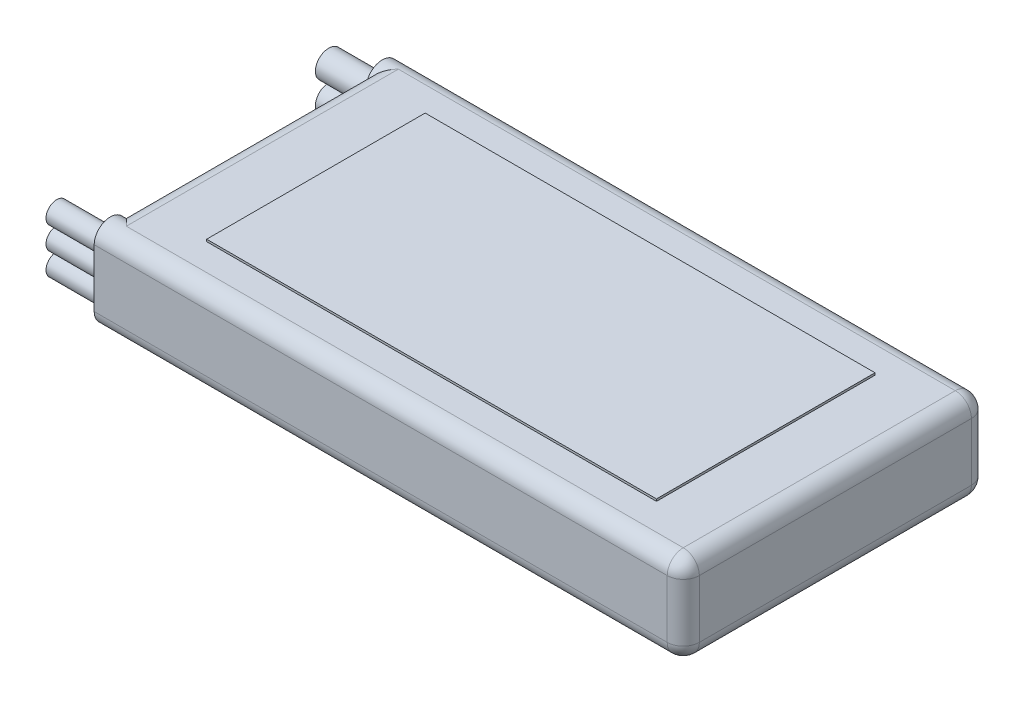
ISO-10303-21;
HEADER;
FILE_DESCRIPTION(('STEP AP214'),'2;1');
FILE_NAME('part.step','',(''),(''),'','','');
FILE_SCHEMA(('AUTOMOTIVE_DESIGN { 1 0 10303 214 1 1 1 1 }'));
ENDSEC;
DATA;
#1=APPLICATION_CONTEXT('core data for automotive mechanical design processes');
#2=APPLICATION_PROTOCOL_DEFINITION('international standard','automotive_design',2000,#1);
#3=PRODUCT_CONTEXT('',#1,'mechanical');
#4=PRODUCT('Part','Part','',(#3));
#5=PRODUCT_RELATED_PRODUCT_CATEGORY('part','',(#4));
#6=PRODUCT_DEFINITION_FORMATION('','',#4);
#7=PRODUCT_DEFINITION_CONTEXT('part definition',#1,'design');
#8=PRODUCT_DEFINITION('design','',#6,#7);
#9=PRODUCT_DEFINITION_SHAPE('','',#8);
#10=(LENGTH_UNIT() NAMED_UNIT(*) SI_UNIT(.MILLI.,.METRE.));
#11=(NAMED_UNIT(*) PLANE_ANGLE_UNIT() SI_UNIT($,.RADIAN.));
#12=(NAMED_UNIT(*) SI_UNIT($,.STERADIAN.) SOLID_ANGLE_UNIT());
#13=UNCERTAINTY_MEASURE_WITH_UNIT(LENGTH_MEASURE(1.E-05),#10,'distance_accuracy_value','');
#14=(GEOMETRIC_REPRESENTATION_CONTEXT(3) GLOBAL_UNCERTAINTY_ASSIGNED_CONTEXT((#13)) GLOBAL_UNIT_ASSIGNED_CONTEXT((#10,
#11,#12)) REPRESENTATION_CONTEXT('',''));
#15=CARTESIAN_POINT('',(0.,0.,0.));
#16=DIRECTION('',(0.,0.,1.));
#17=DIRECTION('',(1.,0.,0.));
#18=AXIS2_PLACEMENT_3D('',#15,#16,#17);
#19=CARTESIAN_POINT('',(0.,10.668,0.));
#20=DIRECTION('',(0.,1.,0.));
#21=DIRECTION('',(0.,0.,1.));
#22=AXIS2_PLACEMENT_3D('',#19,#20,#21);
#23=PLANE('',#22);
#24=DIRECTION('',(0.,0.,-1.));
#25=VECTOR('',#24,1.);
#26=CARTESIAN_POINT('',(41.4199177552008,10.668,-23.1597613288179));
#27=LINE('',#26,#25);
#28=CARTESIAN_POINT('',(41.4199177552008,10.668,11.0032386711821));
#29=VERTEX_POINT('',#28);
#30=CARTESIAN_POINT('',(41.4199177552008,10.668,-21.2547613288179));
#31=VERTEX_POINT('',#30);
#32=EDGE_CURVE('E257',#29,#31,#27,.T.);
#33=ORIENTED_EDGE('',*,*,#32,.T.);
#34=DIRECTION('',(-1.,0.,0.));
#35=VECTOR('',#34,1.);
#36=CARTESIAN_POINT('',(-26.5250822447992,10.668,-21.2547613288179));
#37=LINE('',#36,#35);
#38=CARTESIAN_POINT('',(-24.6200822447992,10.668,-21.2547613288179));
#39=VERTEX_POINT('',#38);
#40=EDGE_CURVE('E259',#31,#39,#37,.T.);
#41=ORIENTED_EDGE('',*,*,#40,.T.);
#42=DIRECTION('',(0.,0.,1.));
#43=VECTOR('',#42,1.);
#44=CARTESIAN_POINT('',(-24.6200822447992,10.668,12.9082386711821));
#45=LINE('',#44,#43);
#46=CARTESIAN_POINT('',(-24.6200822447992,10.668,11.0032386711821));
#47=VERTEX_POINT('',#46);
#48=EDGE_CURVE('E252',#39,#47,#45,.T.);
#49=ORIENTED_EDGE('',*,*,#48,.T.);
#50=DIRECTION('',(1.,0.,0.));
#51=VECTOR('',#50,1.);
#52=CARTESIAN_POINT('',(43.3249177552008,10.668,11.0032386711821));
#53=LINE('',#52,#51);
#54=EDGE_CURVE('E255',#47,#29,#53,.T.);
#55=ORIENTED_EDGE('',*,*,#54,.T.);
#56=EDGE_LOOP('',(#33,#41,#49,#55));
#57=FACE_BOUND('',#56,.T.);
#58=DIRECTION('',(-1.,0.,0.));
#59=VECTOR('',#58,1.);
#60=CARTESIAN_POINT('',(35.0699177552008,10.668,-18.0797613288179));
#61=LINE('',#60,#59);
#62=CARTESIAN_POINT('',(35.0699177552008,10.668,-18.0797613288179));
#63=VERTEX_POINT('',#62);
#64=CARTESIAN_POINT('',(-18.2700822447992,10.668,-18.0797613288179));
#65=VERTEX_POINT('',#64);
#66=EDGE_CURVE('E632',#63,#65,#61,.T.);
#67=ORIENTED_EDGE('',*,*,#66,.F.);
#68=DIRECTION('',(0.,0.,-1.));
#69=VECTOR('',#68,1.);
#70=CARTESIAN_POINT('',(35.0699177552008,10.668,7.82823867118206));
#71=LINE('',#70,#69);
#72=CARTESIAN_POINT('',(35.0699177552008,10.668,7.82823867118206));
#73=VERTEX_POINT('',#72);
#74=EDGE_CURVE('E172',#73,#63,#71,.T.);
#75=ORIENTED_EDGE('',*,*,#74,.F.);
#76=DIRECTION('',(1.,0.,0.));
#77=VECTOR('',#76,1.);
#78=CARTESIAN_POINT('',(35.0699177552008,10.668,7.82823867118206));
#79=LINE('',#78,#77);
#80=CARTESIAN_POINT('',(-18.2700822447992,10.668,7.82823867118207));
#81=VERTEX_POINT('',#80);
#82=EDGE_CURVE('E168',#81,#73,#79,.T.);
#83=ORIENTED_EDGE('',*,*,#82,.F.);
#84=DIRECTION('',(0.,0.,1.));
#85=VECTOR('',#84,1.);
#86=CARTESIAN_POINT('',(-18.2700822447992,10.668,7.82823867118207));
#87=LINE('',#86,#85);
#88=EDGE_CURVE('E629',#65,#81,#87,.T.);
#89=ORIENTED_EDGE('',*,*,#88,.F.);
#90=EDGE_LOOP('',(#67,#75,#83,#89));
#91=FACE_BOUND('',#90,.T.);
#92=ADVANCED_FACE('F35',(#57,#91),#23,.T.);
#93=CARTESIAN_POINT('',(-26.5250822447992,10.668,-23.1597613288179));
#94=DIRECTION('',(1.,0.,0.));
#95=DIRECTION('',(0.,0.,-1.));
#96=AXIS2_PLACEMENT_3D('',#93,#94,#95);
#97=PLANE('',#96);
#98=CARTESIAN_POINT('',(-26.5250822447992,7.112,-21.2547613288179));
#99=DIRECTION('',(1.,0.,0.));
#100=DIRECTION('',(0.,0.,-1.));
#101=AXIS2_PLACEMENT_3D('',#98,#99,#100);
#102=CIRCLE('',#101,1.5875);
#103=CARTESIAN_POINT('',(-26.5250822447992,7.112,-22.8422613288179));
#104=VERTEX_POINT('',#103);
#105=EDGE_CURVE('E43',#104,#104,#102,.F.);
#106=ORIENTED_EDGE('',*,*,#105,.F.);
#107=EDGE_LOOP('',(#106));
#108=FACE_BOUND('',#107,.T.);
#109=CARTESIAN_POINT('',(-26.5250822447992,5.334,11.0032386711821));
#110=DIRECTION('',(1.,0.,0.));
#111=DIRECTION('',(0.,0.,-1.));
#112=AXIS2_PLACEMENT_3D('',#109,#110,#111);
#113=CIRCLE('',#112,1.27);
#114=CARTESIAN_POINT('',(-26.5250822447992,5.334,9.73323867118206));
#115=VERTEX_POINT('',#114);
#116=EDGE_CURVE('E300',#115,#115,#113,.F.);
#117=ORIENTED_EDGE('',*,*,#116,.F.);
#118=EDGE_LOOP('',(#117));
#119=FACE_BOUND('',#118,.T.);
#120=DIRECTION('',(0.,0.,1.));
#121=VECTOR('',#120,1.);
#122=CARTESIAN_POINT('',(-26.5250822447992,8.763,-23.1597613288179));
#123=LINE('',#122,#121);
#124=CARTESIAN_POINT('',(-26.5250822447992,8.763,9.09823867118206));
#125=VERTEX_POINT('',#124);
#126=CARTESIAN_POINT('',(-26.5250822447992,8.763,-19.3497613288179));
#127=VERTEX_POINT('',#126);
#128=EDGE_CURVE('E240',#125,#127,#123,.F.);
#129=ORIENTED_EDGE('',*,*,#128,.T.);
#130=CARTESIAN_POINT('',(-26.5250822447992,8.763,-21.2547613288179));
#131=DIRECTION('',(-1.,0.,0.));
#132=DIRECTION('',(0.,0.,1.));
#133=AXIS2_PLACEMENT_3D('',#130,#131,#132);
#134=CIRCLE('',#133,1.905);
#135=CARTESIAN_POINT('',(-26.5250822447992,8.763,-23.1597613288179));
#136=VERTEX_POINT('',#135);
#137=EDGE_CURVE('E193',#127,#136,#134,.T.);
#138=ORIENTED_EDGE('',*,*,#137,.T.);
#139=DIRECTION('',(0.,-1.,0.));
#140=VECTOR('',#139,1.);
#141=CARTESIAN_POINT('',(-26.5250822447992,8.763,-23.1597613288179));
#142=LINE('',#141,#140);
#143=CARTESIAN_POINT('',(-26.5250822447992,1.905,-23.1597613288179));
#144=VERTEX_POINT('',#143);
#145=EDGE_CURVE('E196',#136,#144,#142,.T.);
#146=ORIENTED_EDGE('',*,*,#145,.T.);
#147=CARTESIAN_POINT('',(-26.5250822447992,1.905,-21.2547613288179));
#148=DIRECTION('',(-1.,0.,0.));
#149=DIRECTION('',(0.,0.,1.));
#150=AXIS2_PLACEMENT_3D('',#147,#148,#149);
#151=CIRCLE('',#150,1.905);
#152=CARTESIAN_POINT('',(-26.5250822447992,1.905,-19.3497613288179));
#153=VERTEX_POINT('',#152);
#154=EDGE_CURVE('E58',#144,#153,#151,.T.);
#155=ORIENTED_EDGE('',*,*,#154,.T.);
#156=DIRECTION('',(0.,0.,1.));
#157=VECTOR('',#156,1.);
#158=CARTESIAN_POINT('',(-26.5250822447992,1.905,-23.1597613288179));
#159=LINE('',#158,#157);
#160=CARTESIAN_POINT('',(-26.5250822447992,1.905,9.09823867118206));
#161=VERTEX_POINT('',#160);
#162=EDGE_CURVE('E243',#153,#161,#159,.T.);
#163=ORIENTED_EDGE('',*,*,#162,.T.);
#164=CARTESIAN_POINT('',(-26.5250822447992,1.905,11.0032386711821));
#165=DIRECTION('',(-1.,0.,0.));
#166=DIRECTION('',(0.,0.,1.));
#167=AXIS2_PLACEMENT_3D('',#164,#165,#166);
#168=CIRCLE('',#167,1.905);
#169=CARTESIAN_POINT('',(-26.5250822447992,1.905,12.9082386711821));
#170=VERTEX_POINT('',#169);
#171=EDGE_CURVE('E202',#161,#170,#168,.T.);
#172=ORIENTED_EDGE('',*,*,#171,.T.);
#173=DIRECTION('',(0.,1.,0.));
#174=VECTOR('',#173,1.);
#175=CARTESIAN_POINT('',(-26.5250822447992,8.763,12.9082386711821));
#176=LINE('',#175,#174);
#177=CARTESIAN_POINT('',(-26.5250822447992,8.763,12.9082386711821));
#178=VERTEX_POINT('',#177);
#179=EDGE_CURVE('E205',#170,#178,#176,.T.);
#180=ORIENTED_EDGE('',*,*,#179,.T.);
#181=CARTESIAN_POINT('',(-26.5250822447992,8.763,11.0032386711821));
#182=DIRECTION('',(-1.,0.,0.));
#183=DIRECTION('',(0.,0.,1.));
#184=AXIS2_PLACEMENT_3D('',#181,#182,#183);
#185=CIRCLE('',#184,1.905);
#186=EDGE_CURVE('E199',#178,#125,#185,.T.);
#187=ORIENTED_EDGE('',*,*,#186,.T.);
#188=EDGE_LOOP('',(#129,#138,#146,#155,#163,#172,#180,#187));
#189=FACE_BOUND('',#188,.T.);
#190=CARTESIAN_POINT('',(-26.5250822447992,8.001,11.0032386711821));
#191=DIRECTION('',(1.,0.,0.));
#192=DIRECTION('',(0.,0.,-1.));
#193=AXIS2_PLACEMENT_3D('',#190,#191,#192);
#194=CIRCLE('',#193,1.27);
#195=CARTESIAN_POINT('',(-26.5250822447992,8.001,9.73323867118206));
#196=VERTEX_POINT('',#195);
#197=EDGE_CURVE('E297',#196,#196,#194,.F.);
#198=ORIENTED_EDGE('',*,*,#197,.F.);
#199=EDGE_LOOP('',(#198));
#200=FACE_BOUND('',#199,.T.);
#201=CARTESIAN_POINT('',(-26.5250822447992,2.667,11.0032386711821));
#202=DIRECTION('',(1.,0.,0.));
#203=DIRECTION('',(0.,0.,-1.));
#204=AXIS2_PLACEMENT_3D('',#201,#202,#203);
#205=CIRCLE('',#204,1.27);
#206=CARTESIAN_POINT('',(-26.5250822447992,2.667,9.73323867118206));
#207=VERTEX_POINT('',#206);
#208=EDGE_CURVE('E303',#207,#207,#205,.F.);
#209=ORIENTED_EDGE('',*,*,#208,.F.);
#210=EDGE_LOOP('',(#209));
#211=FACE_BOUND('',#210,.T.);
#212=CARTESIAN_POINT('',(-26.5250822447992,3.556,-21.2547613288179));
#213=DIRECTION('',(1.,0.,0.));
#214=DIRECTION('',(0.,0.,-1.));
#215=AXIS2_PLACEMENT_3D('',#212,#213,#214);
#216=CIRCLE('',#215,1.5875);
#217=CARTESIAN_POINT('',(-26.5250822447992,3.556,-22.8422613288179));
#218=VERTEX_POINT('',#217);
#219=EDGE_CURVE('E11',#218,#218,#216,.F.);
#220=ORIENTED_EDGE('',*,*,#219,.F.);
#221=EDGE_LOOP('',(#220));
#222=FACE_BOUND('',#221,.T.);
#223=ADVANCED_FACE('F310',(#108,#119,#189,#200,#211,#222),#97,.F.);
#224=CARTESIAN_POINT('',(-26.5250822447992,10.668,12.9082386711821));
#225=DIRECTION('',(0.,0.,-1.));
#226=DIRECTION('',(-1.,0.,0.));
#227=AXIS2_PLACEMENT_3D('',#224,#225,#226);
#228=PLANE('',#227);
#229=DIRECTION('',(1.,0.,0.));
#230=VECTOR('',#229,1.);
#231=CARTESIAN_POINT('',(-26.5250822447992,1.905,12.9082386711821));
#232=LINE('',#231,#230);
#233=CARTESIAN_POINT('',(41.4199177552008,1.905,12.9082386711821));
#234=VERTEX_POINT('',#233);
#235=EDGE_CURVE('E226',#170,#234,#232,.T.);
#236=ORIENTED_EDGE('',*,*,#235,.T.);
#237=DIRECTION('',(0.,-1.,0.));
#238=VECTOR('',#237,1.);
#239=CARTESIAN_POINT('',(41.4199177552008,10.668,12.9082386711821));
#240=LINE('',#239,#238);
#241=CARTESIAN_POINT('',(41.4199177552008,8.763,12.9082386711821));
#242=VERTEX_POINT('',#241);
#243=EDGE_CURVE('E228',#234,#242,#240,.F.);
#244=ORIENTED_EDGE('',*,*,#243,.T.);
#245=DIRECTION('',(1.,0.,0.));
#246=VECTOR('',#245,1.);
#247=CARTESIAN_POINT('',(-26.5250822447992,8.763,12.9082386711821));
#248=LINE('',#247,#246);
#249=EDGE_CURVE('E224',#242,#178,#248,.F.);
#250=ORIENTED_EDGE('',*,*,#249,.T.);
#251=ORIENTED_EDGE('',*,*,#179,.F.);
#252=EDGE_LOOP('',(#236,#244,#250,#251));
#253=FACE_BOUND('',#252,.T.);
#254=ADVANCED_FACE('F313',(#253),#228,.F.);
#255=CARTESIAN_POINT('',(43.3249177552008,10.668,-23.1597613288179));
#256=DIRECTION('',(-1.,0.,0.));
#257=DIRECTION('',(0.,0.,1.));
#258=AXIS2_PLACEMENT_3D('',#255,#256,#257);
#259=PLANE('',#258);
#260=DIRECTION('',(0.,0.,-1.));
#261=VECTOR('',#260,1.);
#262=CARTESIAN_POINT('',(43.3249177552008,8.763,12.9082386711821));
#263=LINE('',#262,#261);
#264=CARTESIAN_POINT('',(43.3249177552008,8.763,-21.2547613288179));
#265=VERTEX_POINT('',#264);
#266=CARTESIAN_POINT('',(43.3249177552008,8.763,11.0032386711821));
#267=VERTEX_POINT('',#266);
#268=EDGE_CURVE('E214',#265,#267,#263,.F.);
#269=ORIENTED_EDGE('',*,*,#268,.T.);
#270=DIRECTION('',(0.,-1.,0.));
#271=VECTOR('',#270,1.);
#272=CARTESIAN_POINT('',(43.3249177552008,10.668,11.0032386711821));
#273=LINE('',#272,#271);
#274=CARTESIAN_POINT('',(43.3249177552008,1.905,11.0032386711821));
#275=VERTEX_POINT('',#274);
#276=EDGE_CURVE('E221',#267,#275,#273,.T.);
#277=ORIENTED_EDGE('',*,*,#276,.T.);
#278=DIRECTION('',(0.,0.,-1.));
#279=VECTOR('',#278,1.);
#280=CARTESIAN_POINT('',(43.3249177552008,1.905,-23.1597613288179));
#281=LINE('',#280,#279);
#282=CARTESIAN_POINT('',(43.3249177552008,1.905,-21.2547613288179));
#283=VERTEX_POINT('',#282);
#284=EDGE_CURVE('E219',#275,#283,#281,.T.);
#285=ORIENTED_EDGE('',*,*,#284,.T.);
#286=DIRECTION('',(0.,-1.,0.));
#287=VECTOR('',#286,1.);
#288=CARTESIAN_POINT('',(43.3249177552008,10.668,-21.2547613288179));
#289=LINE('',#288,#287);
#290=EDGE_CURVE('E216',#283,#265,#289,.F.);
#291=ORIENTED_EDGE('',*,*,#290,.T.);
#292=EDGE_LOOP('',(#269,#277,#285,#291));
#293=FACE_BOUND('',#292,.T.);
#294=ADVANCED_FACE('F356',(#293),#259,.F.);
#295=CARTESIAN_POINT('',(-26.5250822447992,10.668,-23.1597613288179));
#296=DIRECTION('',(0.,0.,1.));
#297=DIRECTION('',(1.,0.,0.));
#298=AXIS2_PLACEMENT_3D('',#295,#296,#297);
#299=PLANE('',#298);
#300=DIRECTION('',(-1.,0.,0.));
#301=VECTOR('',#300,1.);
#302=CARTESIAN_POINT('',(43.3249177552008,8.763,-23.1597613288179));
#303=LINE('',#302,#301);
#304=CARTESIAN_POINT('',(41.4199177552008,8.763,-23.1597613288179));
#305=VERTEX_POINT('',#304);
#306=EDGE_CURVE('E245',#136,#305,#303,.F.);
#307=ORIENTED_EDGE('',*,*,#306,.T.);
#308=DIRECTION('',(0.,-1.,0.));
#309=VECTOR('',#308,1.);
#310=CARTESIAN_POINT('',(41.4199177552008,10.668,-23.1597613288179));
#311=LINE('',#310,#309);
#312=CARTESIAN_POINT('',(41.4199177552008,1.905,-23.1597613288179));
#313=VERTEX_POINT('',#312);
#314=EDGE_CURVE('E247',#305,#313,#311,.T.);
#315=ORIENTED_EDGE('',*,*,#314,.T.);
#316=DIRECTION('',(-1.,0.,0.));
#317=VECTOR('',#316,1.);
#318=CARTESIAN_POINT('',(-26.5250822447992,1.905,-23.1597613288179));
#319=LINE('',#318,#317);
#320=EDGE_CURVE('E250',#313,#144,#319,.T.);
#321=ORIENTED_EDGE('',*,*,#320,.T.);
#322=ORIENTED_EDGE('',*,*,#145,.F.);
#323=EDGE_LOOP('',(#307,#315,#321,#322));
#324=FACE_BOUND('',#323,.T.);
#325=ADVANCED_FACE('F352',(#324),#299,.F.);
#326=CARTESIAN_POINT('',(0.,0.,0.));
#327=DIRECTION('',(0.,1.,0.));
#328=DIRECTION('',(0.,0.,1.));
#329=AXIS2_PLACEMENT_3D('',#326,#327,#328);
#330=PLANE('',#329);
#331=DIRECTION('',(0.,0.,-1.));
#332=VECTOR('',#331,1.);
#333=CARTESIAN_POINT('',(41.4199177552008,0.,0.));
#334=LINE('',#333,#332);
#335=CARTESIAN_POINT('',(41.4199177552008,0.,-21.2547613288179));
#336=VERTEX_POINT('',#335);
#337=CARTESIAN_POINT('',(41.4199177552008,0.,11.0032386711821));
#338=VERTEX_POINT('',#337);
#339=EDGE_CURVE('E236',#336,#338,#334,.F.);
#340=ORIENTED_EDGE('',*,*,#339,.T.);
#341=DIRECTION('',(1.,0.,0.));
#342=VECTOR('',#341,1.);
#343=CARTESIAN_POINT('',(0.,0.,11.0032386711821));
#344=LINE('',#343,#342);
#345=CARTESIAN_POINT('',(-24.6200822447992,0.,11.0032386711821));
#346=VERTEX_POINT('',#345);
#347=EDGE_CURVE('E238',#338,#346,#344,.F.);
#348=ORIENTED_EDGE('',*,*,#347,.T.);
#349=DIRECTION('',(0.,0.,1.));
#350=VECTOR('',#349,1.);
#351=CARTESIAN_POINT('',(-24.6200822447992,0.,0.));
#352=LINE('',#351,#350);
#353=CARTESIAN_POINT('',(-24.6200822447992,0.,-21.2547613288179));
#354=VERTEX_POINT('',#353);
#355=EDGE_CURVE('E233',#346,#354,#352,.F.);
#356=ORIENTED_EDGE('',*,*,#355,.T.);
#357=DIRECTION('',(-1.,0.,0.));
#358=VECTOR('',#357,1.);
#359=CARTESIAN_POINT('',(0.,0.,-21.2547613288179));
#360=LINE('',#359,#358);
#361=EDGE_CURVE('E231',#354,#336,#360,.F.);
#362=ORIENTED_EDGE('',*,*,#361,.T.);
#363=EDGE_LOOP('',(#340,#348,#356,#362));
#364=FACE_BOUND('',#363,.T.);
#365=ADVANCED_FACE('F349',(#364),#330,.F.);
#366=CARTESIAN_POINT('',(-24.6200822447992,8.763,0.));
#367=DIRECTION('',(0.,0.,-1.));
#368=DIRECTION('',(-1.,0.,0.));
#369=AXIS2_PLACEMENT_3D('',#366,#367,#368);
#370=CYLINDRICAL_SURFACE('',#369,1.905);
#371=CARTESIAN_POINT('',(-24.6200822447992,8.763,-21.2547613288179));
#372=DIRECTION('',(-0.707106781186548,0.,-0.707106781186547));
#373=DIRECTION('',(0.707106781186547,0.,-0.707106781186548));
#374=AXIS2_PLACEMENT_3D('',#371,#372,#373);
#375=ELLIPSE('',#374,2.69407683632074,1.905);
#376=EDGE_CURVE('E294',#127,#39,#375,.T.);
#377=ORIENTED_EDGE('',*,*,#376,.F.);
#378=ORIENTED_EDGE('',*,*,#128,.F.);
#379=CARTESIAN_POINT('',(-24.6200822447992,8.763,11.0032386711821));
#380=DIRECTION('',(0.707106781186547,0.,-0.707106781186548));
#381=DIRECTION('',(-0.707106781186548,0.,-0.707106781186547));
#382=AXIS2_PLACEMENT_3D('',#379,#380,#381);
#383=ELLIPSE('',#382,2.69407683632075,1.905);
#384=EDGE_CURVE('E211',#47,#125,#383,.F.);
#385=ORIENTED_EDGE('',*,*,#384,.F.);
#386=ORIENTED_EDGE('',*,*,#48,.F.);
#387=EDGE_LOOP('',(#377,#378,#385,#386));
#388=FACE_BOUND('',#387,.T.);
#389=ADVANCED_FACE('F37',(#388),#370,.T.);
#390=CARTESIAN_POINT('',(0.,8.763,-21.2547613288179));
#391=DIRECTION('',(1.,0.,0.));
#392=DIRECTION('',(0.,0.,-1.));
#393=AXIS2_PLACEMENT_3D('',#390,#391,#392);
#394=CYLINDRICAL_SURFACE('',#393,1.905);
#395=ORIENTED_EDGE('',*,*,#376,.T.);
#396=ORIENTED_EDGE('',*,*,#40,.F.);
#397=CARTESIAN_POINT('',(41.4199177552008,8.763,-21.2547613288179));
#398=DIRECTION('',(1.,0.,0.));
#399=DIRECTION('',(0.,1.,0.));
#400=AXIS2_PLACEMENT_3D('',#397,#398,#399);
#401=CIRCLE('',#400,1.905);
#402=EDGE_CURVE('E217',#305,#31,#401,.T.);
#403=ORIENTED_EDGE('',*,*,#402,.F.);
#404=ORIENTED_EDGE('',*,*,#306,.F.);
#405=ORIENTED_EDGE('',*,*,#137,.F.);
#406=EDGE_LOOP('',(#395,#396,#403,#404,#405));
#407=FACE_BOUND('',#406,.T.);
#408=ADVANCED_FACE('F410',(#407),#394,.T.);
#409=CARTESIAN_POINT('',(41.4199177552008,10.668,-21.2547613288179));
#410=DIRECTION('',(0.,-1.,0.));
#411=DIRECTION('',(0.,0.,-1.));
#412=AXIS2_PLACEMENT_3D('',#409,#410,#411);
#413=CYLINDRICAL_SURFACE('',#412,1.905);
#414=CARTESIAN_POINT('',(41.4199177552008,1.905,-21.2547613288179));
#415=DIRECTION('',(0.,-1.,0.));
#416=DIRECTION('',(0.,0.,-1.));
#417=AXIS2_PLACEMENT_3D('',#414,#415,#416);
#418=CIRCLE('',#417,1.905);
#419=EDGE_CURVE('E285',#313,#283,#418,.T.);
#420=ORIENTED_EDGE('',*,*,#419,.F.);
#421=ORIENTED_EDGE('',*,*,#314,.F.);
#422=CARTESIAN_POINT('',(41.4199177552008,8.763,-21.2547613288179));
#423=DIRECTION('',(0.,1.,0.));
#424=DIRECTION('',(0.,0.,1.));
#425=AXIS2_PLACEMENT_3D('',#422,#423,#424);
#426=CIRCLE('',#425,1.905);
#427=EDGE_CURVE('E288',#265,#305,#426,.T.);
#428=ORIENTED_EDGE('',*,*,#427,.F.);
#429=ORIENTED_EDGE('',*,*,#290,.F.);
#430=EDGE_LOOP('',(#420,#421,#428,#429));
#431=FACE_BOUND('',#430,.T.);
#432=ADVANCED_FACE('F407',(#431),#413,.T.);
#433=CARTESIAN_POINT('',(-26.5250822447992,1.905,-21.2547613288179));
#434=DIRECTION('',(-1.,0.,0.));
#435=DIRECTION('',(0.,0.,1.));
#436=AXIS2_PLACEMENT_3D('',#433,#434,#435);
#437=CYLINDRICAL_SURFACE('',#436,1.905);
#438=ORIENTED_EDGE('',*,*,#154,.F.);
#439=ORIENTED_EDGE('',*,*,#320,.F.);
#440=CARTESIAN_POINT('',(41.4199177552008,1.905,-21.2547613288179));
#441=DIRECTION('',(1.,0.,0.));
#442=DIRECTION('',(0.,0.,-1.));
#443=AXIS2_PLACEMENT_3D('',#440,#441,#442);
#444=CIRCLE('',#443,1.905);
#445=EDGE_CURVE('E283',#336,#313,#444,.T.);
#446=ORIENTED_EDGE('',*,*,#445,.F.);
#447=ORIENTED_EDGE('',*,*,#361,.F.);
#448=CARTESIAN_POINT('',(-24.6200822447992,1.905,-21.2547613288179));
#449=DIRECTION('',(0.707106781186548,0.,0.707106781186547));
#450=DIRECTION('',(-0.707106781186547,0.,0.707106781186548));
#451=AXIS2_PLACEMENT_3D('',#448,#449,#450);
#452=ELLIPSE('',#451,2.69407683632074,1.905);
#453=EDGE_CURVE('E261',#354,#153,#452,.F.);
#454=ORIENTED_EDGE('',*,*,#453,.T.);
#455=EDGE_LOOP('',(#438,#439,#446,#447,#454));
#456=FACE_BOUND('',#455,.T.);
#457=ADVANCED_FACE('F403',(#456),#437,.T.);
#458=CARTESIAN_POINT('',(-24.6200822447992,1.905,-23.1597613288179));
#459=DIRECTION('',(0.,0.,1.));
#460=DIRECTION('',(1.,0.,0.));
#461=AXIS2_PLACEMENT_3D('',#458,#459,#460);
#462=CYLINDRICAL_SURFACE('',#461,1.905);
#463=ORIENTED_EDGE('',*,*,#453,.F.);
#464=ORIENTED_EDGE('',*,*,#355,.F.);
#465=CARTESIAN_POINT('',(-24.6200822447992,1.905,11.0032386711821));
#466=DIRECTION('',(-0.707106781186547,0.,0.707106781186548));
#467=DIRECTION('',(0.707106781186548,0.,0.707106781186547));
#468=AXIS2_PLACEMENT_3D('',#465,#466,#467);
#469=ELLIPSE('',#468,2.69407683632075,1.905);
#470=EDGE_CURVE('E208',#161,#346,#469,.T.);
#471=ORIENTED_EDGE('',*,*,#470,.F.);
#472=ORIENTED_EDGE('',*,*,#162,.F.);
#473=EDGE_LOOP('',(#463,#464,#471,#472));
#474=FACE_BOUND('',#473,.T.);
#475=ADVANCED_FACE('F399',(#474),#462,.T.);
#476=CARTESIAN_POINT('',(41.4199177552008,8.763,-21.2547613288179));
#477=DIRECTION('',(0.,0.,1.));
#478=DIRECTION('',(1.,0.,0.));
#479=AXIS2_PLACEMENT_3D('',#476,#477,#478);
#480=SPHERICAL_SURFACE('',#479,1.905);
#481=ORIENTED_EDGE('',*,*,#427,.T.);
#482=ORIENTED_EDGE('',*,*,#402,.T.);
#483=CARTESIAN_POINT('',(41.4199177552008,8.763,-21.2547613288179));
#484=DIRECTION('',(0.,0.,-1.));
#485=DIRECTION('',(-1.,0.,0.));
#486=AXIS2_PLACEMENT_3D('',#483,#484,#485);
#487=CIRCLE('',#486,1.905);
#488=EDGE_CURVE('E280',#265,#31,#487,.F.);
#489=ORIENTED_EDGE('',*,*,#488,.F.);
#490=EDGE_LOOP('',(#481,#482,#489));
#491=FACE_BOUND('',#490,.T.);
#492=ADVANCED_FACE('F395',(#491),#480,.T.);
#493=CARTESIAN_POINT('',(41.4199177552008,1.905,-21.2547613288179));
#494=DIRECTION('',(0.,0.,1.));
#495=DIRECTION('',(1.,0.,0.));
#496=AXIS2_PLACEMENT_3D('',#493,#494,#495);
#497=SPHERICAL_SURFACE('',#496,1.905);
#498=ORIENTED_EDGE('',*,*,#445,.T.);
#499=ORIENTED_EDGE('',*,*,#419,.T.);
#500=CARTESIAN_POINT('',(41.4199177552008,1.905,-21.2547613288179));
#501=DIRECTION('',(0.,0.,-1.));
#502=DIRECTION('',(-1.,0.,0.));
#503=AXIS2_PLACEMENT_3D('',#500,#501,#502);
#504=CIRCLE('',#503,1.905);
#505=EDGE_CURVE('E277',#336,#283,#504,.F.);
#506=ORIENTED_EDGE('',*,*,#505,.F.);
#507=EDGE_LOOP('',(#498,#499,#506));
#508=FACE_BOUND('',#507,.T.);
#509=ADVANCED_FACE('F391',(#508),#497,.T.);
#510=CARTESIAN_POINT('',(0.,8.763,11.0032386711821));
#511=DIRECTION('',(-1.,0.,0.));
#512=DIRECTION('',(0.,0.,1.));
#513=AXIS2_PLACEMENT_3D('',#510,#511,#512);
#514=CYLINDRICAL_SURFACE('',#513,1.905);
#515=ORIENTED_EDGE('',*,*,#186,.F.);
#516=ORIENTED_EDGE('',*,*,#249,.F.);
#517=CARTESIAN_POINT('',(41.4199177552008,8.763,11.0032386711821));
#518=DIRECTION('',(1.,0.,0.));
#519=DIRECTION('',(0.,0.,-1.));
#520=AXIS2_PLACEMENT_3D('',#517,#518,#519);
#521=CIRCLE('',#520,1.905);
#522=EDGE_CURVE('E274',#29,#242,#521,.T.);
#523=ORIENTED_EDGE('',*,*,#522,.F.);
#524=ORIENTED_EDGE('',*,*,#54,.F.);
#525=ORIENTED_EDGE('',*,*,#384,.T.);
#526=EDGE_LOOP('',(#515,#516,#523,#524,#525));
#527=FACE_BOUND('',#526,.T.);
#528=ADVANCED_FACE('F387',(#527),#514,.T.);
#529=CARTESIAN_POINT('',(41.4199177552008,8.763,0.));
#530=DIRECTION('',(0.,0.,1.));
#531=DIRECTION('',(1.,0.,0.));
#532=AXIS2_PLACEMENT_3D('',#529,#530,#531);
#533=CYLINDRICAL_SURFACE('',#532,1.905);
#534=ORIENTED_EDGE('',*,*,#488,.T.);
#535=ORIENTED_EDGE('',*,*,#32,.F.);
#536=CARTESIAN_POINT('',(41.4199177552008,8.763,11.0032386711821));
#537=DIRECTION('',(0.,0.,1.));
#538=DIRECTION('',(0.,-1.,0.));
#539=AXIS2_PLACEMENT_3D('',#536,#537,#538);
#540=CIRCLE('',#539,1.905);
#541=EDGE_CURVE('E271',#267,#29,#540,.T.);
#542=ORIENTED_EDGE('',*,*,#541,.F.);
#543=ORIENTED_EDGE('',*,*,#268,.F.);
#544=EDGE_LOOP('',(#534,#535,#542,#543));
#545=FACE_BOUND('',#544,.T.);
#546=ADVANCED_FACE('F383',(#545),#533,.T.);
#547=CARTESIAN_POINT('',(41.4199177552008,1.905,-23.1597613288179));
#548=DIRECTION('',(0.,0.,-1.));
#549=DIRECTION('',(-1.,0.,0.));
#550=AXIS2_PLACEMENT_3D('',#547,#548,#549);
#551=CYLINDRICAL_SURFACE('',#550,1.905);
#552=ORIENTED_EDGE('',*,*,#505,.T.);
#553=ORIENTED_EDGE('',*,*,#284,.F.);
#554=CARTESIAN_POINT('',(41.4199177552008,1.905,11.0032386711821));
#555=DIRECTION('',(0.,0.,1.));
#556=DIRECTION('',(1.,0.,0.));
#557=AXIS2_PLACEMENT_3D('',#554,#555,#556);
#558=CIRCLE('',#557,1.905);
#559=EDGE_CURVE('E268',#338,#275,#558,.T.);
#560=ORIENTED_EDGE('',*,*,#559,.F.);
#561=ORIENTED_EDGE('',*,*,#339,.F.);
#562=EDGE_LOOP('',(#552,#553,#560,#561));
#563=FACE_BOUND('',#562,.T.);
#564=ADVANCED_FACE('F379',(#563),#551,.T.);
#565=CARTESIAN_POINT('',(-26.5250822447992,1.905,11.0032386711821));
#566=DIRECTION('',(1.,0.,0.));
#567=DIRECTION('',(0.,0.,-1.));
#568=AXIS2_PLACEMENT_3D('',#565,#566,#567);
#569=CYLINDRICAL_SURFACE('',#568,1.905);
#570=ORIENTED_EDGE('',*,*,#470,.T.);
#571=ORIENTED_EDGE('',*,*,#347,.F.);
#572=CARTESIAN_POINT('',(41.4199177552008,1.905,11.0032386711821));
#573=DIRECTION('',(1.,0.,0.));
#574=DIRECTION('',(0.,0.,-1.));
#575=AXIS2_PLACEMENT_3D('',#572,#573,#574);
#576=CIRCLE('',#575,1.905);
#577=EDGE_CURVE('E265',#234,#338,#576,.T.);
#578=ORIENTED_EDGE('',*,*,#577,.F.);
#579=ORIENTED_EDGE('',*,*,#235,.F.);
#580=ORIENTED_EDGE('',*,*,#171,.F.);
#581=EDGE_LOOP('',(#570,#571,#578,#579,#580));
#582=FACE_BOUND('',#581,.T.);
#583=ADVANCED_FACE('F375',(#582),#569,.T.);
#584=CARTESIAN_POINT('',(41.4199177552008,8.763,11.0032386711821));
#585=DIRECTION('',(0.,0.,1.));
#586=DIRECTION('',(1.,0.,0.));
#587=AXIS2_PLACEMENT_3D('',#584,#585,#586);
#588=SPHERICAL_SURFACE('',#587,1.905);
#589=ORIENTED_EDGE('',*,*,#541,.T.);
#590=ORIENTED_EDGE('',*,*,#522,.T.);
#591=CARTESIAN_POINT('',(41.4199177552008,8.763,11.0032386711821));
#592=DIRECTION('',(0.,1.,0.));
#593=DIRECTION('',(0.,0.,1.));
#594=AXIS2_PLACEMENT_3D('',#591,#592,#593);
#595=CIRCLE('',#594,1.905);
#596=EDGE_CURVE('E263',#267,#242,#595,.F.);
#597=ORIENTED_EDGE('',*,*,#596,.F.);
#598=EDGE_LOOP('',(#589,#590,#597));
#599=FACE_BOUND('',#598,.T.);
#600=ADVANCED_FACE('F371',(#599),#588,.T.);
#601=CARTESIAN_POINT('',(41.4199177552008,1.905,11.0032386711821));
#602=DIRECTION('',(0.,0.,1.));
#603=DIRECTION('',(1.,0.,0.));
#604=AXIS2_PLACEMENT_3D('',#601,#602,#603);
#605=SPHERICAL_SURFACE('',#604,1.905);
#606=ORIENTED_EDGE('',*,*,#577,.T.);
#607=ORIENTED_EDGE('',*,*,#559,.T.);
#608=CARTESIAN_POINT('',(41.4199177552008,1.905,11.0032386711821));
#609=DIRECTION('',(0.,-1.,0.));
#610=DIRECTION('',(0.,0.,-1.));
#611=AXIS2_PLACEMENT_3D('',#608,#609,#610);
#612=CIRCLE('',#611,1.905);
#613=EDGE_CURVE('E213',#234,#275,#612,.F.);
#614=ORIENTED_EDGE('',*,*,#613,.F.);
#615=EDGE_LOOP('',(#606,#607,#614));
#616=FACE_BOUND('',#615,.T.);
#617=ADVANCED_FACE('F367',(#616),#605,.T.);
#618=CARTESIAN_POINT('',(41.4199177552008,10.668,11.0032386711821));
#619=DIRECTION('',(0.,-1.,0.));
#620=DIRECTION('',(0.,0.,-1.));
#621=AXIS2_PLACEMENT_3D('',#618,#619,#620);
#622=CYLINDRICAL_SURFACE('',#621,1.905);
#623=ORIENTED_EDGE('',*,*,#596,.T.);
#624=ORIENTED_EDGE('',*,*,#243,.F.);
#625=ORIENTED_EDGE('',*,*,#613,.T.);
#626=ORIENTED_EDGE('',*,*,#276,.F.);
#627=EDGE_LOOP('',(#623,#624,#625,#626));
#628=FACE_BOUND('',#627,.T.);
#629=ADVANCED_FACE('F364',(#628),#622,.T.);
#630=CARTESIAN_POINT('',(-32.8750822447992,8.001,11.0032386711821));
#631=DIRECTION('',(1.,0.,0.));
#632=DIRECTION('',(0.,0.,-1.));
#633=AXIS2_PLACEMENT_3D('',#630,#631,#632);
#634=CYLINDRICAL_SURFACE('',#633,1.27);
#635=CARTESIAN_POINT('',(-32.8750822447992,8.001,11.0032386711821));
#636=DIRECTION('',(-1.,0.,0.));
#637=DIRECTION('',(0.,0.,1.));
#638=AXIS2_PLACEMENT_3D('',#635,#636,#637);
#639=CIRCLE('',#638,1.27);
#640=CARTESIAN_POINT('',(-32.8750822447992,8.001,12.2732386711821));
#641=VERTEX_POINT('',#640);
#642=EDGE_CURVE('E190',#641,#641,#639,.T.);
#643=ORIENTED_EDGE('',*,*,#642,.F.);
#644=EDGE_LOOP('',(#643));
#645=FACE_BOUND('',#644,.T.);
#646=ORIENTED_EDGE('',*,*,#197,.T.);
#647=EDGE_LOOP('',(#646));
#648=FACE_BOUND('',#647,.T.);
#649=ADVANCED_FACE('F347',(#645,#648),#634,.T.);
#650=CARTESIAN_POINT('',(-32.8750822447992,8.001,11.0032386711821));
#651=DIRECTION('',(-1.,0.,0.));
#652=DIRECTION('',(0.,0.,1.));
#653=AXIS2_PLACEMENT_3D('',#650,#651,#652);
#654=PLANE('',#653);
#655=ORIENTED_EDGE('',*,*,#642,.T.);
#656=EDGE_LOOP('',(#655));
#657=FACE_BOUND('',#656,.T.);
#658=ADVANCED_FACE('F492',(#657),#654,.T.);
#659=CARTESIAN_POINT('',(-32.8750822447992,5.334,11.0032386711821));
#660=DIRECTION('',(1.,0.,0.));
#661=DIRECTION('',(0.,0.,-1.));
#662=AXIS2_PLACEMENT_3D('',#659,#660,#661);
#663=CYLINDRICAL_SURFACE('',#662,1.27);
#664=CARTESIAN_POINT('',(-32.8750822447992,5.334,11.0032386711821));
#665=DIRECTION('',(-1.,0.,0.));
#666=DIRECTION('',(0.,0.,1.));
#667=AXIS2_PLACEMENT_3D('',#664,#665,#666);
#668=CIRCLE('',#667,1.27);
#669=CARTESIAN_POINT('',(-32.8750822447992,5.334,12.2732386711821));
#670=VERTEX_POINT('',#669);
#671=EDGE_CURVE('E187',#670,#670,#668,.T.);
#672=ORIENTED_EDGE('',*,*,#671,.F.);
#673=EDGE_LOOP('',(#672));
#674=FACE_BOUND('',#673,.T.);
#675=ORIENTED_EDGE('',*,*,#116,.T.);
#676=EDGE_LOOP('',(#675));
#677=FACE_BOUND('',#676,.T.);
#678=ADVANCED_FACE('F502',(#674,#677),#663,.T.);
#679=CARTESIAN_POINT('',(-32.8750822447992,5.334,11.0032386711821));
#680=DIRECTION('',(-1.,0.,0.));
#681=DIRECTION('',(0.,0.,1.));
#682=AXIS2_PLACEMENT_3D('',#679,#680,#681);
#683=PLANE('',#682);
#684=ORIENTED_EDGE('',*,*,#671,.T.);
#685=EDGE_LOOP('',(#684));
#686=FACE_BOUND('',#685,.T.);
#687=ADVANCED_FACE('F513',(#686),#683,.T.);
#688=CARTESIAN_POINT('',(-32.8750822447992,2.667,11.0032386711821));
#689=DIRECTION('',(1.,0.,0.));
#690=DIRECTION('',(0.,0.,-1.));
#691=AXIS2_PLACEMENT_3D('',#688,#689,#690);
#692=CYLINDRICAL_SURFACE('',#691,1.27);
#693=CARTESIAN_POINT('',(-32.8750822447992,2.667,11.0032386711821));
#694=DIRECTION('',(-1.,0.,0.));
#695=DIRECTION('',(0.,0.,1.));
#696=AXIS2_PLACEMENT_3D('',#693,#694,#695);
#697=CIRCLE('',#696,1.27);
#698=CARTESIAN_POINT('',(-32.8750822447992,2.667,12.2732386711821));
#699=VERTEX_POINT('',#698);
#700=EDGE_CURVE('E184',#699,#699,#697,.T.);
#701=ORIENTED_EDGE('',*,*,#700,.F.);
#702=EDGE_LOOP('',(#701));
#703=FACE_BOUND('',#702,.T.);
#704=ORIENTED_EDGE('',*,*,#208,.T.);
#705=EDGE_LOOP('',(#704));
#706=FACE_BOUND('',#705,.T.);
#707=ADVANCED_FACE('F525',(#703,#706),#692,.T.);
#708=CARTESIAN_POINT('',(-32.8750822447992,2.667,11.0032386711821));
#709=DIRECTION('',(-1.,0.,0.));
#710=DIRECTION('',(0.,0.,1.));
#711=AXIS2_PLACEMENT_3D('',#708,#709,#710);
#712=PLANE('',#711);
#713=ORIENTED_EDGE('',*,*,#700,.T.);
#714=EDGE_LOOP('',(#713));
#715=FACE_BOUND('',#714,.T.);
#716=ADVANCED_FACE('F536',(#715),#712,.T.);
#717=CARTESIAN_POINT('',(-32.8750822447992,7.112,-21.2547613288179));
#718=DIRECTION('',(1.,0.,0.));
#719=DIRECTION('',(0.,0.,-1.));
#720=AXIS2_PLACEMENT_3D('',#717,#718,#719);
#721=CYLINDRICAL_SURFACE('',#720,1.5875);
#722=CARTESIAN_POINT('',(-32.8750822447992,7.112,-21.2547613288179));
#723=DIRECTION('',(-1.,0.,0.));
#724=DIRECTION('',(0.,0.,1.));
#725=AXIS2_PLACEMENT_3D('',#722,#723,#724);
#726=CIRCLE('',#725,1.5875);
#727=CARTESIAN_POINT('',(-32.8750822447992,7.112,-19.6672613288179));
#728=VERTEX_POINT('',#727);
#729=EDGE_CURVE('E177',#728,#728,#726,.T.);
#730=ORIENTED_EDGE('',*,*,#729,.F.);
#731=EDGE_LOOP('',(#730));
#732=FACE_BOUND('',#731,.T.);
#733=ORIENTED_EDGE('',*,*,#105,.T.);
#734=EDGE_LOOP('',(#733));
#735=FACE_BOUND('',#734,.T.);
#736=ADVANCED_FACE('F308',(#732,#735),#721,.T.);
#737=CARTESIAN_POINT('',(-32.8750822447992,7.112,-21.2547613288179));
#738=DIRECTION('',(-1.,0.,0.));
#739=DIRECTION('',(0.,0.,1.));
#740=AXIS2_PLACEMENT_3D('',#737,#738,#739);
#741=PLANE('',#740);
#742=ORIENTED_EDGE('',*,*,#729,.T.);
#743=EDGE_LOOP('',(#742));
#744=FACE_BOUND('',#743,.T.);
#745=ADVANCED_FACE('F327',(#744),#741,.T.);
#746=CARTESIAN_POINT('',(-32.8750822447992,3.556,-21.2547613288179));
#747=DIRECTION('',(1.,0.,0.));
#748=DIRECTION('',(0.,0.,-1.));
#749=AXIS2_PLACEMENT_3D('',#746,#747,#748);
#750=CYLINDRICAL_SURFACE('',#749,1.5875);
#751=CARTESIAN_POINT('',(-32.8750822447992,3.556,-21.2547613288179));
#752=DIRECTION('',(-1.,0.,0.));
#753=DIRECTION('',(0.,0.,1.));
#754=AXIS2_PLACEMENT_3D('',#751,#752,#753);
#755=CIRCLE('',#754,1.5875);
#756=CARTESIAN_POINT('',(-32.8750822447992,3.556,-19.6672613288179));
#757=VERTEX_POINT('',#756);
#758=EDGE_CURVE('E174',#757,#757,#755,.T.);
#759=ORIENTED_EDGE('',*,*,#758,.F.);
#760=EDGE_LOOP('',(#759));
#761=FACE_BOUND('',#760,.T.);
#762=ORIENTED_EDGE('',*,*,#219,.T.);
#763=EDGE_LOOP('',(#762));
#764=FACE_BOUND('',#763,.T.);
#765=ADVANCED_FACE('F324',(#761,#764),#750,.T.);
#766=CARTESIAN_POINT('',(-32.8750822447992,3.556,-21.2547613288179));
#767=DIRECTION('',(-1.,0.,0.));
#768=DIRECTION('',(0.,0.,1.));
#769=AXIS2_PLACEMENT_3D('',#766,#767,#768);
#770=PLANE('',#769);
#771=ORIENTED_EDGE('',*,*,#758,.T.);
#772=EDGE_LOOP('',(#771));
#773=FACE_BOUND('',#772,.T.);
#774=ADVANCED_FACE('F326',(#773),#770,.T.);
#775=CARTESIAN_POINT('',(35.0699177552008,10.922,7.82823867118206));
#776=DIRECTION('',(-1.,0.,0.));
#777=DIRECTION('',(0.,0.,1.));
#778=AXIS2_PLACEMENT_3D('',#775,#776,#777);
#779=PLANE('',#778);
#780=ORIENTED_EDGE('',*,*,#74,.T.);
#781=DIRECTION('',(0.,-1.,0.));
#782=VECTOR('',#781,1.);
#783=CARTESIAN_POINT('',(35.0699177552008,10.922,-18.0797613288179));
#784=LINE('',#783,#782);
#785=CARTESIAN_POINT('',(35.0699177552008,10.922,-18.0797613288179));
#786=VERTEX_POINT('',#785);
#787=EDGE_CURVE('E153',#786,#63,#784,.T.);
#788=ORIENTED_EDGE('',*,*,#787,.F.);
#789=DIRECTION('',(0.,0.,-1.));
#790=VECTOR('',#789,1.);
#791=CARTESIAN_POINT('',(35.0699177552008,10.922,7.82823867118206));
#792=LINE('',#791,#790);
#793=CARTESIAN_POINT('',(35.0699177552008,10.922,7.82823867118206));
#794=VERTEX_POINT('',#793);
#795=EDGE_CURVE('E160',#794,#786,#792,.T.);
#796=ORIENTED_EDGE('',*,*,#795,.F.);
#797=DIRECTION('',(0.,-1.,0.));
#798=VECTOR('',#797,1.);
#799=CARTESIAN_POINT('',(35.0699177552008,10.922,7.82823867118206));
#800=LINE('',#799,#798);
#801=EDGE_CURVE('E627',#794,#73,#800,.T.);
#802=ORIENTED_EDGE('',*,*,#801,.T.);
#803=EDGE_LOOP('',(#780,#788,#796,#802));
#804=FACE_BOUND('',#803,.T.);
#805=ADVANCED_FACE('F170',(#804),#779,.F.);
#806=CARTESIAN_POINT('',(35.0699177552008,10.922,-18.0797613288179));
#807=DIRECTION('',(0.,0.,1.));
#808=DIRECTION('',(1.,0.,0.));
#809=AXIS2_PLACEMENT_3D('',#806,#807,#808);
#810=PLANE('',#809);
#811=ORIENTED_EDGE('',*,*,#66,.T.);
#812=DIRECTION('',(0.,-1.,0.));
#813=VECTOR('',#812,1.);
#814=CARTESIAN_POINT('',(-18.2700822447992,10.922,-18.0797613288179));
#815=LINE('',#814,#813);
#816=CARTESIAN_POINT('',(-18.2700822447992,10.922,-18.0797613288179));
#817=VERTEX_POINT('',#816);
#818=EDGE_CURVE('E156',#817,#65,#815,.T.);
#819=ORIENTED_EDGE('',*,*,#818,.F.);
#820=DIRECTION('',(-1.,0.,0.));
#821=VECTOR('',#820,1.);
#822=CARTESIAN_POINT('',(35.0699177552008,10.922,-18.0797613288179));
#823=LINE('',#822,#821);
#824=EDGE_CURVE('E149',#786,#817,#823,.T.);
#825=ORIENTED_EDGE('',*,*,#824,.F.);
#826=ORIENTED_EDGE('',*,*,#787,.T.);
#827=EDGE_LOOP('',(#811,#819,#825,#826));
#828=FACE_BOUND('',#827,.T.);
#829=ADVANCED_FACE('F151',(#828),#810,.F.);
#830=CARTESIAN_POINT('',(-18.2700822447992,10.922,7.82823867118207));
#831=DIRECTION('',(1.,0.,0.));
#832=DIRECTION('',(0.,0.,-1.));
#833=AXIS2_PLACEMENT_3D('',#830,#831,#832);
#834=PLANE('',#833);
#835=ORIENTED_EDGE('',*,*,#88,.T.);
#836=DIRECTION('',(0.,-1.,0.));
#837=VECTOR('',#836,1.);
#838=CARTESIAN_POINT('',(-18.2700822447992,10.922,7.82823867118207));
#839=LINE('',#838,#837);
#840=CARTESIAN_POINT('',(-18.2700822447992,10.922,7.82823867118207));
#841=VERTEX_POINT('',#840);
#842=EDGE_CURVE('E50',#841,#81,#839,.T.);
#843=ORIENTED_EDGE('',*,*,#842,.F.);
#844=DIRECTION('',(0.,0.,1.));
#845=VECTOR('',#844,1.);
#846=CARTESIAN_POINT('',(-18.2700822447992,10.922,7.82823867118207));
#847=LINE('',#846,#845);
#848=EDGE_CURVE('E159',#817,#841,#847,.T.);
#849=ORIENTED_EDGE('',*,*,#848,.F.);
#850=ORIENTED_EDGE('',*,*,#818,.T.);
#851=EDGE_LOOP('',(#835,#843,#849,#850));
#852=FACE_BOUND('',#851,.T.);
#853=ADVANCED_FACE('F596',(#852),#834,.F.);
#854=CARTESIAN_POINT('',(35.0699177552008,10.922,7.82823867118206));
#855=DIRECTION('',(0.,0.,-1.));
#856=DIRECTION('',(-1.,0.,0.));
#857=AXIS2_PLACEMENT_3D('',#854,#855,#856);
#858=PLANE('',#857);
#859=ORIENTED_EDGE('',*,*,#82,.T.);
#860=ORIENTED_EDGE('',*,*,#801,.F.);
#861=DIRECTION('',(1.,0.,0.));
#862=VECTOR('',#861,1.);
#863=CARTESIAN_POINT('',(35.0699177552008,10.922,7.82823867118206));
#864=LINE('',#863,#862);
#865=EDGE_CURVE('E164',#841,#794,#864,.T.);
#866=ORIENTED_EDGE('',*,*,#865,.F.);
#867=ORIENTED_EDGE('',*,*,#842,.T.);
#868=EDGE_LOOP('',(#859,#860,#866,#867));
#869=FACE_BOUND('',#868,.T.);
#870=ADVANCED_FACE('F605',(#869),#858,.F.);
#871=CARTESIAN_POINT('',(0.,10.922,0.));
#872=DIRECTION('',(0.,1.,0.));
#873=DIRECTION('',(0.,0.,1.));
#874=AXIS2_PLACEMENT_3D('',#871,#872,#873);
#875=PLANE('',#874);
#876=ORIENTED_EDGE('',*,*,#795,.T.);
#877=ORIENTED_EDGE('',*,*,#824,.T.);
#878=ORIENTED_EDGE('',*,*,#848,.T.);
#879=ORIENTED_EDGE('',*,*,#865,.T.);
#880=EDGE_LOOP('',(#876,#877,#878,#879));
#881=FACE_BOUND('',#880,.T.);
#882=ADVANCED_FACE('F163',(#881),#875,.T.);
#883=CLOSED_SHELL('',(#92,#223,#254,#294,#325,#365,#389,#408,#432,#457,#475,#492,#509,#528,#546,
#564,#583,#600,#617,#629,#649,#658,#678,#687,#707,#716,#736,#745,#765,#774,#805,#829,#853,#870,#882));
#884=MANIFOLD_SOLID_BREP('B2',#883);
#885=ADVANCED_BREP_SHAPE_REPRESENTATION('',(#18,#884),#14);
#886=SHAPE_DEFINITION_REPRESENTATION(#9,#885);
ENDSEC;
END-ISO-10303-21;
